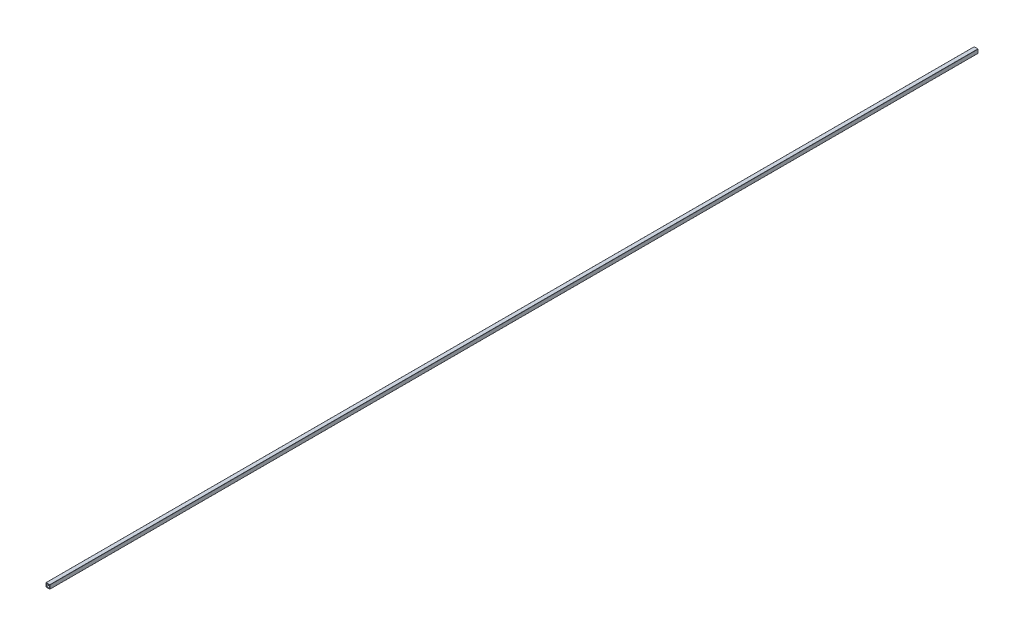
ISO-10303-21;
HEADER;
FILE_DESCRIPTION(('STEP AP214'),'2;1');
FILE_NAME('part.step','',(''),(''),'','','');
FILE_SCHEMA(('AUTOMOTIVE_DESIGN { 1 0 10303 214 1 1 1 1 }'));
ENDSEC;
DATA;
#1=APPLICATION_CONTEXT('core data for automotive mechanical design processes');
#2=APPLICATION_PROTOCOL_DEFINITION('international standard','automotive_design',2000,#1);
#3=PRODUCT_CONTEXT('',#1,'mechanical');
#4=PRODUCT('Part','Part','',(#3));
#5=PRODUCT_RELATED_PRODUCT_CATEGORY('part','',(#4));
#6=PRODUCT_DEFINITION_FORMATION('','',#4);
#7=PRODUCT_DEFINITION_CONTEXT('part definition',#1,'design');
#8=PRODUCT_DEFINITION('design','',#6,#7);
#9=PRODUCT_DEFINITION_SHAPE('','',#8);
#10=(LENGTH_UNIT() NAMED_UNIT(*) SI_UNIT(.MILLI.,.METRE.));
#11=(NAMED_UNIT(*) PLANE_ANGLE_UNIT() SI_UNIT($,.RADIAN.));
#12=(NAMED_UNIT(*) SI_UNIT($,.STERADIAN.) SOLID_ANGLE_UNIT());
#13=UNCERTAINTY_MEASURE_WITH_UNIT(LENGTH_MEASURE(1.E-05),#10,'distance_accuracy_value','');
#14=(GEOMETRIC_REPRESENTATION_CONTEXT(3) GLOBAL_UNCERTAINTY_ASSIGNED_CONTEXT((#13)) GLOBAL_UNIT_ASSIGNED_CONTEXT((#10,
#11,#12)) REPRESENTATION_CONTEXT('',''));
#15=CARTESIAN_POINT('',(0.,0.,0.));
#16=DIRECTION('',(0.,0.,1.));
#17=DIRECTION('',(1.,0.,0.));
#18=AXIS2_PLACEMENT_3D('',#15,#16,#17);
#19=CARTESIAN_POINT('',(11.7,-11.7,6000.));
#20=DIRECTION('',(0.,0.,1.));
#21=DIRECTION('',(1.,0.,0.));
#22=AXIS2_PLACEMENT_3D('',#19,#20,#21);
#23=PLANE('',#22);
#24=CARTESIAN_POINT('',(11.7,-11.7,6000.));
#25=DIRECTION('',(0.,0.,1.));
#26=DIRECTION('',(1.,0.,0.));
#27=AXIS2_PLACEMENT_3D('',#24,#25,#26);
#28=CIRCLE('',#27,0.999999999999999);
#29=CARTESIAN_POINT('',(11.7,-12.7,6000.));
#30=VERTEX_POINT('',#29);
#31=CARTESIAN_POINT('',(12.7,-11.7,6000.));
#32=VERTEX_POINT('',#31);
#33=EDGE_CURVE('E158',#30,#32,#28,.T.);
#34=ORIENTED_EDGE('',*,*,#33,.T.);
#35=DIRECTION('',(0.,1.,0.));
#36=VECTOR('',#35,1.);
#37=CARTESIAN_POINT('',(12.7,-11.7,6000.));
#38=LINE('',#37,#36);
#39=CARTESIAN_POINT('',(12.7,11.7,6000.));
#40=VERTEX_POINT('',#39);
#41=EDGE_CURVE('E161',#32,#40,#38,.T.);
#42=ORIENTED_EDGE('',*,*,#41,.T.);
#43=CARTESIAN_POINT('',(11.7,11.7,6000.));
#44=DIRECTION('',(0.,0.,1.));
#45=DIRECTION('',(-1.,0.,0.));
#46=AXIS2_PLACEMENT_3D('',#43,#44,#45);
#47=CIRCLE('',#46,0.999999999999999);
#48=CARTESIAN_POINT('',(11.7,12.7,6000.));
#49=VERTEX_POINT('',#48);
#50=EDGE_CURVE('E164',#40,#49,#47,.T.);
#51=ORIENTED_EDGE('',*,*,#50,.T.);
#52=DIRECTION('',(-1.,0.,0.));
#53=VECTOR('',#52,1.);
#54=CARTESIAN_POINT('',(-11.7,12.7,6000.));
#55=LINE('',#54,#53);
#56=CARTESIAN_POINT('',(-11.7,12.7,6000.));
#57=VERTEX_POINT('',#56);
#58=EDGE_CURVE('E166',#49,#57,#55,.T.);
#59=ORIENTED_EDGE('',*,*,#58,.T.);
#60=CARTESIAN_POINT('',(-11.7,11.7,6000.));
#61=DIRECTION('',(0.,0.,1.));
#62=DIRECTION('',(-1.,0.,0.));
#63=AXIS2_PLACEMENT_3D('',#60,#61,#62);
#64=CIRCLE('',#63,0.999999999999999);
#65=CARTESIAN_POINT('',(-12.7,11.7,6000.));
#66=VERTEX_POINT('',#65);
#67=EDGE_CURVE('E168',#57,#66,#64,.T.);
#68=ORIENTED_EDGE('',*,*,#67,.T.);
#69=DIRECTION('',(0.,-1.,0.));
#70=VECTOR('',#69,1.);
#71=CARTESIAN_POINT('',(-12.7,-11.7,6000.));
#72=LINE('',#71,#70);
#73=CARTESIAN_POINT('',(-12.7,-11.7,6000.));
#74=VERTEX_POINT('',#73);
#75=EDGE_CURVE('E170',#66,#74,#72,.T.);
#76=ORIENTED_EDGE('',*,*,#75,.T.);
#77=CARTESIAN_POINT('',(-11.7,-11.7,6000.));
#78=DIRECTION('',(0.,0.,1.));
#79=DIRECTION('',(-1.,0.,0.));
#80=AXIS2_PLACEMENT_3D('',#77,#78,#79);
#81=CIRCLE('',#80,0.999999999999999);
#82=CARTESIAN_POINT('',(-11.7,-12.7,6000.));
#83=VERTEX_POINT('',#82);
#84=EDGE_CURVE('E172',#74,#83,#81,.T.);
#85=ORIENTED_EDGE('',*,*,#84,.T.);
#86=DIRECTION('',(1.,0.,0.));
#87=VECTOR('',#86,1.);
#88=CARTESIAN_POINT('',(-11.7,-12.7,6000.));
#89=LINE('',#88,#87);
#90=EDGE_CURVE('E174',#83,#30,#89,.T.);
#91=ORIENTED_EDGE('',*,*,#90,.T.);
#92=EDGE_LOOP('',(#34,#42,#51,#59,#68,#76,#85,#91));
#93=FACE_BOUND('',#92,.T.);
#94=DIRECTION('',(0.,1.,0.));
#95=VECTOR('',#94,1.);
#96=CARTESIAN_POINT('',(9.28,-9.28,6000.));
#97=LINE('',#96,#95);
#98=CARTESIAN_POINT('',(9.28,-9.28,6000.));
#99=VERTEX_POINT('',#98);
#100=CARTESIAN_POINT('',(9.28,9.28,6000.));
#101=VERTEX_POINT('',#100);
#102=EDGE_CURVE('E130',#99,#101,#97,.T.);
#103=ORIENTED_EDGE('',*,*,#102,.F.);
#104=DIRECTION('',(1.,0.,0.));
#105=VECTOR('',#104,1.);
#106=CARTESIAN_POINT('',(-9.28,-9.28,6000.));
#107=LINE('',#106,#105);
#108=CARTESIAN_POINT('',(-9.28,-9.28,6000.));
#109=VERTEX_POINT('',#108);
#110=EDGE_CURVE('E122',#109,#99,#107,.T.);
#111=ORIENTED_EDGE('',*,*,#110,.F.);
#112=DIRECTION('',(0.,-1.,0.));
#113=VECTOR('',#112,1.);
#114=CARTESIAN_POINT('',(-9.28,-9.28,6000.));
#115=LINE('',#114,#113);
#116=CARTESIAN_POINT('',(-9.28,9.28,6000.));
#117=VERTEX_POINT('',#116);
#118=EDGE_CURVE('E144',#117,#109,#115,.T.);
#119=ORIENTED_EDGE('',*,*,#118,.F.);
#120=DIRECTION('',(-1.,0.,0.));
#121=VECTOR('',#120,1.);
#122=CARTESIAN_POINT('',(-9.28,9.28,6000.));
#123=LINE('',#122,#121);
#124=EDGE_CURVE('E142',#101,#117,#123,.T.);
#125=ORIENTED_EDGE('',*,*,#124,.F.);
#126=EDGE_LOOP('',(#103,#111,#119,#125));
#127=FACE_BOUND('',#126,.T.);
#128=ADVANCED_FACE('F33',(#93,#127),#23,.T.);
#129=CARTESIAN_POINT('',(11.7,-11.7,0.));
#130=DIRECTION('',(0.,0.,1.));
#131=DIRECTION('',(1.,0.,0.));
#132=AXIS2_PLACEMENT_3D('',#129,#130,#131);
#133=PLANE('',#132);
#134=CARTESIAN_POINT('',(11.7,-11.7,0.));
#135=DIRECTION('',(0.,0.,1.));
#136=DIRECTION('',(1.,0.,0.));
#137=AXIS2_PLACEMENT_3D('',#134,#135,#136);
#138=CIRCLE('',#137,0.999999999999999);
#139=CARTESIAN_POINT('',(11.7,-12.7,0.));
#140=VERTEX_POINT('',#139);
#141=CARTESIAN_POINT('',(12.7,-11.7,0.));
#142=VERTEX_POINT('',#141);
#143=EDGE_CURVE('E138',#140,#142,#138,.T.);
#144=ORIENTED_EDGE('',*,*,#143,.F.);
#145=DIRECTION('',(1.,0.,0.));
#146=VECTOR('',#145,1.);
#147=CARTESIAN_POINT('',(-11.7,-12.7,0.));
#148=LINE('',#147,#146);
#149=CARTESIAN_POINT('',(-11.7,-12.7,0.));
#150=VERTEX_POINT('',#149);
#151=EDGE_CURVE('E162',#150,#140,#148,.T.);
#152=ORIENTED_EDGE('',*,*,#151,.F.);
#153=CARTESIAN_POINT('',(-11.7,-11.7,0.));
#154=DIRECTION('',(0.,0.,1.));
#155=DIRECTION('',(-1.,0.,0.));
#156=AXIS2_PLACEMENT_3D('',#153,#154,#155);
#157=CIRCLE('',#156,0.999999999999999);
#158=CARTESIAN_POINT('',(-12.7,-11.7,0.));
#159=VERTEX_POINT('',#158);
#160=EDGE_CURVE('E189',#159,#150,#157,.T.);
#161=ORIENTED_EDGE('',*,*,#160,.F.);
#162=DIRECTION('',(0.,-1.,0.));
#163=VECTOR('',#162,1.);
#164=CARTESIAN_POINT('',(-12.7,-11.7,0.));
#165=LINE('',#164,#163);
#166=CARTESIAN_POINT('',(-12.7,11.7,0.));
#167=VERTEX_POINT('',#166);
#168=EDGE_CURVE('E187',#167,#159,#165,.T.);
#169=ORIENTED_EDGE('',*,*,#168,.F.);
#170=CARTESIAN_POINT('',(-11.7,11.7,0.));
#171=DIRECTION('',(0.,0.,1.));
#172=DIRECTION('',(-1.,0.,0.));
#173=AXIS2_PLACEMENT_3D('',#170,#171,#172);
#174=CIRCLE('',#173,0.999999999999999);
#175=CARTESIAN_POINT('',(-11.7,12.7,0.));
#176=VERTEX_POINT('',#175);
#177=EDGE_CURVE('E185',#176,#167,#174,.T.);
#178=ORIENTED_EDGE('',*,*,#177,.F.);
#179=DIRECTION('',(-1.,0.,0.));
#180=VECTOR('',#179,1.);
#181=CARTESIAN_POINT('',(-11.7,12.7,0.));
#182=LINE('',#181,#180);
#183=CARTESIAN_POINT('',(11.7,12.7,0.));
#184=VERTEX_POINT('',#183);
#185=EDGE_CURVE('E183',#184,#176,#182,.T.);
#186=ORIENTED_EDGE('',*,*,#185,.F.);
#187=CARTESIAN_POINT('',(11.7,11.7,0.));
#188=DIRECTION('',(0.,0.,1.));
#189=DIRECTION('',(-1.,0.,0.));
#190=AXIS2_PLACEMENT_3D('',#187,#188,#189);
#191=CIRCLE('',#190,0.999999999999999);
#192=CARTESIAN_POINT('',(12.7,11.7,0.));
#193=VERTEX_POINT('',#192);
#194=EDGE_CURVE('E181',#193,#184,#191,.T.);
#195=ORIENTED_EDGE('',*,*,#194,.F.);
#196=DIRECTION('',(0.,1.,0.));
#197=VECTOR('',#196,1.);
#198=CARTESIAN_POINT('',(12.7,-11.7,0.));
#199=LINE('',#198,#197);
#200=EDGE_CURVE('E179',#142,#193,#199,.T.);
#201=ORIENTED_EDGE('',*,*,#200,.F.);
#202=EDGE_LOOP('',(#144,#152,#161,#169,#178,#186,#195,#201));
#203=FACE_BOUND('',#202,.T.);
#204=DIRECTION('',(1.,0.,0.));
#205=VECTOR('',#204,1.);
#206=CARTESIAN_POINT('',(-9.28,-9.28,0.));
#207=LINE('',#206,#205);
#208=CARTESIAN_POINT('',(-9.28,-9.28,0.));
#209=VERTEX_POINT('',#208);
#210=CARTESIAN_POINT('',(9.28,-9.28,0.));
#211=VERTEX_POINT('',#210);
#212=EDGE_CURVE('E56',#209,#211,#207,.T.);
#213=ORIENTED_EDGE('',*,*,#212,.T.);
#214=DIRECTION('',(0.,1.,0.));
#215=VECTOR('',#214,1.);
#216=CARTESIAN_POINT('',(9.28,-9.28,0.));
#217=LINE('',#216,#215);
#218=CARTESIAN_POINT('',(9.28,9.28,0.));
#219=VERTEX_POINT('',#218);
#220=EDGE_CURVE('E137',#211,#219,#217,.T.);
#221=ORIENTED_EDGE('',*,*,#220,.T.);
#222=DIRECTION('',(-1.,0.,0.));
#223=VECTOR('',#222,1.);
#224=CARTESIAN_POINT('',(-9.28,9.28,0.));
#225=LINE('',#224,#223);
#226=CARTESIAN_POINT('',(-9.28,9.28,0.));
#227=VERTEX_POINT('',#226);
#228=EDGE_CURVE('E150',#219,#227,#225,.T.);
#229=ORIENTED_EDGE('',*,*,#228,.T.);
#230=DIRECTION('',(0.,-1.,0.));
#231=VECTOR('',#230,1.);
#232=CARTESIAN_POINT('',(-9.28,-9.28,0.));
#233=LINE('',#232,#231);
#234=EDGE_CURVE('E131',#227,#209,#233,.T.);
#235=ORIENTED_EDGE('',*,*,#234,.T.);
#236=EDGE_LOOP('',(#213,#221,#229,#235));
#237=FACE_BOUND('',#236,.T.);
#238=ADVANCED_FACE('F219',(#203,#237),#133,.F.);
#239=CARTESIAN_POINT('',(11.7,-11.7,6000.));
#240=DIRECTION('',(0.,0.,-1.));
#241=DIRECTION('',(-1.,0.,0.));
#242=AXIS2_PLACEMENT_3D('',#239,#240,#241);
#243=CYLINDRICAL_SURFACE('',#242,0.999999999999999);
#244=ORIENTED_EDGE('',*,*,#143,.T.);
#245=DIRECTION('',(0.,0.,-1.));
#246=VECTOR('',#245,1.);
#247=CARTESIAN_POINT('',(12.7,-11.7,6000.));
#248=LINE('',#247,#246);
#249=EDGE_CURVE('E11',#32,#142,#248,.T.);
#250=ORIENTED_EDGE('',*,*,#249,.F.);
#251=ORIENTED_EDGE('',*,*,#33,.F.);
#252=DIRECTION('',(0.,0.,-1.));
#253=VECTOR('',#252,1.);
#254=CARTESIAN_POINT('',(11.7,-12.7,6000.));
#255=LINE('',#254,#253);
#256=EDGE_CURVE('E176',#30,#140,#255,.T.);
#257=ORIENTED_EDGE('',*,*,#256,.T.);
#258=EDGE_LOOP('',(#244,#250,#251,#257));
#259=FACE_BOUND('',#258,.T.);
#260=ADVANCED_FACE('F35',(#259),#243,.T.);
#261=CARTESIAN_POINT('',(12.7,-11.7,6000.));
#262=DIRECTION('',(-1.,0.,0.));
#263=DIRECTION('',(0.,0.,1.));
#264=AXIS2_PLACEMENT_3D('',#261,#262,#263);
#265=PLANE('',#264);
#266=ORIENTED_EDGE('',*,*,#200,.T.);
#267=DIRECTION('',(0.,0.,-1.));
#268=VECTOR('',#267,1.);
#269=CARTESIAN_POINT('',(12.7,11.7,6000.));
#270=LINE('',#269,#268);
#271=EDGE_CURVE('E41',#40,#193,#270,.T.);
#272=ORIENTED_EDGE('',*,*,#271,.F.);
#273=ORIENTED_EDGE('',*,*,#41,.F.);
#274=ORIENTED_EDGE('',*,*,#249,.T.);
#275=EDGE_LOOP('',(#266,#272,#273,#274));
#276=FACE_BOUND('',#275,.T.);
#277=ADVANCED_FACE('F236',(#276),#265,.F.);
#278=CARTESIAN_POINT('',(11.7,11.7,6000.));
#279=DIRECTION('',(0.,0.,-1.));
#280=DIRECTION('',(-1.,0.,0.));
#281=AXIS2_PLACEMENT_3D('',#278,#279,#280);
#282=CYLINDRICAL_SURFACE('',#281,0.999999999999999);
#283=ORIENTED_EDGE('',*,*,#194,.T.);
#284=DIRECTION('',(0.,0.,-1.));
#285=VECTOR('',#284,1.);
#286=CARTESIAN_POINT('',(11.7,12.7,6000.));
#287=LINE('',#286,#285);
#288=EDGE_CURVE('E206',#49,#184,#287,.T.);
#289=ORIENTED_EDGE('',*,*,#288,.F.);
#290=ORIENTED_EDGE('',*,*,#50,.F.);
#291=ORIENTED_EDGE('',*,*,#271,.T.);
#292=EDGE_LOOP('',(#283,#289,#290,#291));
#293=FACE_BOUND('',#292,.T.);
#294=ADVANCED_FACE('F213',(#293),#282,.T.);
#295=CARTESIAN_POINT('',(-11.7,12.7,6000.));
#296=DIRECTION('',(0.,-1.,0.));
#297=DIRECTION('',(0.,0.,-1.));
#298=AXIS2_PLACEMENT_3D('',#295,#296,#297);
#299=PLANE('',#298);
#300=ORIENTED_EDGE('',*,*,#185,.T.);
#301=DIRECTION('',(0.,0.,-1.));
#302=VECTOR('',#301,1.);
#303=CARTESIAN_POINT('',(-11.7,12.7,6000.));
#304=LINE('',#303,#302);
#305=EDGE_CURVE('E203',#57,#176,#304,.T.);
#306=ORIENTED_EDGE('',*,*,#305,.F.);
#307=ORIENTED_EDGE('',*,*,#58,.F.);
#308=ORIENTED_EDGE('',*,*,#288,.T.);
#309=EDGE_LOOP('',(#300,#306,#307,#308));
#310=FACE_BOUND('',#309,.T.);
#311=ADVANCED_FACE('F225',(#310),#299,.F.);
#312=CARTESIAN_POINT('',(-11.7,11.7,6000.));
#313=DIRECTION('',(0.,0.,-1.));
#314=DIRECTION('',(-1.,0.,0.));
#315=AXIS2_PLACEMENT_3D('',#312,#313,#314);
#316=CYLINDRICAL_SURFACE('',#315,0.999999999999999);
#317=ORIENTED_EDGE('',*,*,#177,.T.);
#318=DIRECTION('',(0.,0.,-1.));
#319=VECTOR('',#318,1.);
#320=CARTESIAN_POINT('',(-12.7,11.7,6000.));
#321=LINE('',#320,#319);
#322=EDGE_CURVE('E200',#66,#167,#321,.T.);
#323=ORIENTED_EDGE('',*,*,#322,.F.);
#324=ORIENTED_EDGE('',*,*,#67,.F.);
#325=ORIENTED_EDGE('',*,*,#305,.T.);
#326=EDGE_LOOP('',(#317,#323,#324,#325));
#327=FACE_BOUND('',#326,.T.);
#328=ADVANCED_FACE('F229',(#327),#316,.T.);
#329=CARTESIAN_POINT('',(-12.7,-11.7,6000.));
#330=DIRECTION('',(1.,0.,0.));
#331=DIRECTION('',(0.,0.,-1.));
#332=AXIS2_PLACEMENT_3D('',#329,#330,#331);
#333=PLANE('',#332);
#334=ORIENTED_EDGE('',*,*,#168,.T.);
#335=DIRECTION('',(0.,0.,-1.));
#336=VECTOR('',#335,1.);
#337=CARTESIAN_POINT('',(-12.7,-11.7,6000.));
#338=LINE('',#337,#336);
#339=EDGE_CURVE('E197',#74,#159,#338,.T.);
#340=ORIENTED_EDGE('',*,*,#339,.F.);
#341=ORIENTED_EDGE('',*,*,#75,.F.);
#342=ORIENTED_EDGE('',*,*,#322,.T.);
#343=EDGE_LOOP('',(#334,#340,#341,#342));
#344=FACE_BOUND('',#343,.T.);
#345=ADVANCED_FACE('F249',(#344),#333,.F.);
#346=CARTESIAN_POINT('',(-11.7,-11.7,6000.));
#347=DIRECTION('',(0.,0.,-1.));
#348=DIRECTION('',(-1.,0.,0.));
#349=AXIS2_PLACEMENT_3D('',#346,#347,#348);
#350=CYLINDRICAL_SURFACE('',#349,0.999999999999999);
#351=ORIENTED_EDGE('',*,*,#160,.T.);
#352=DIRECTION('',(0.,0.,-1.));
#353=VECTOR('',#352,1.);
#354=CARTESIAN_POINT('',(-11.7,-12.7,6000.));
#355=LINE('',#354,#353);
#356=EDGE_CURVE('E194',#83,#150,#355,.T.);
#357=ORIENTED_EDGE('',*,*,#356,.F.);
#358=ORIENTED_EDGE('',*,*,#84,.F.);
#359=ORIENTED_EDGE('',*,*,#339,.T.);
#360=EDGE_LOOP('',(#351,#357,#358,#359));
#361=FACE_BOUND('',#360,.T.);
#362=ADVANCED_FACE('F247',(#361),#350,.T.);
#363=CARTESIAN_POINT('',(-11.7,-12.7,6000.));
#364=DIRECTION('',(0.,1.,0.));
#365=DIRECTION('',(0.,0.,1.));
#366=AXIS2_PLACEMENT_3D('',#363,#364,#365);
#367=PLANE('',#366);
#368=ORIENTED_EDGE('',*,*,#151,.T.);
#369=ORIENTED_EDGE('',*,*,#256,.F.);
#370=ORIENTED_EDGE('',*,*,#90,.F.);
#371=ORIENTED_EDGE('',*,*,#356,.T.);
#372=EDGE_LOOP('',(#368,#369,#370,#371));
#373=FACE_BOUND('',#372,.T.);
#374=ADVANCED_FACE('F242',(#373),#367,.F.);
#375=CARTESIAN_POINT('',(-9.28,-9.28,6000.));
#376=DIRECTION('',(0.,1.,0.));
#377=DIRECTION('',(0.,0.,1.));
#378=AXIS2_PLACEMENT_3D('',#375,#376,#377);
#379=PLANE('',#378);
#380=ORIENTED_EDGE('',*,*,#212,.F.);
#381=DIRECTION('',(0.,0.,-1.));
#382=VECTOR('',#381,1.);
#383=CARTESIAN_POINT('',(-9.28,-9.28,6000.));
#384=LINE('',#383,#382);
#385=EDGE_CURVE('E126',#109,#209,#384,.T.);
#386=ORIENTED_EDGE('',*,*,#385,.F.);
#387=ORIENTED_EDGE('',*,*,#110,.T.);
#388=DIRECTION('',(0.,0.,-1.));
#389=VECTOR('',#388,1.);
#390=CARTESIAN_POINT('',(9.28,-9.28,6000.));
#391=LINE('',#390,#389);
#392=EDGE_CURVE('E125',#99,#211,#391,.T.);
#393=ORIENTED_EDGE('',*,*,#392,.T.);
#394=EDGE_LOOP('',(#380,#386,#387,#393));
#395=FACE_BOUND('',#394,.T.);
#396=ADVANCED_FACE('F124',(#395),#379,.T.);
#397=CARTESIAN_POINT('',(9.28,-9.28,6000.));
#398=DIRECTION('',(-1.,0.,0.));
#399=DIRECTION('',(0.,-1.,0.));
#400=AXIS2_PLACEMENT_3D('',#397,#398,#399);
#401=PLANE('',#400);
#402=ORIENTED_EDGE('',*,*,#220,.F.);
#403=ORIENTED_EDGE('',*,*,#392,.F.);
#404=ORIENTED_EDGE('',*,*,#102,.T.);
#405=DIRECTION('',(0.,0.,-1.));
#406=VECTOR('',#405,1.);
#407=CARTESIAN_POINT('',(9.28,9.28,6000.));
#408=LINE('',#407,#406);
#409=EDGE_CURVE('E139',#101,#219,#408,.T.);
#410=ORIENTED_EDGE('',*,*,#409,.T.);
#411=EDGE_LOOP('',(#402,#403,#404,#410));
#412=FACE_BOUND('',#411,.T.);
#413=ADVANCED_FACE('F134',(#412),#401,.T.);
#414=CARTESIAN_POINT('',(-9.28,9.28,6000.));
#415=DIRECTION('',(0.,-1.,0.));
#416=DIRECTION('',(0.,0.,-1.));
#417=AXIS2_PLACEMENT_3D('',#414,#415,#416);
#418=PLANE('',#417);
#419=ORIENTED_EDGE('',*,*,#228,.F.);
#420=ORIENTED_EDGE('',*,*,#409,.F.);
#421=ORIENTED_EDGE('',*,*,#124,.T.);
#422=DIRECTION('',(0.,0.,-1.));
#423=VECTOR('',#422,1.);
#424=CARTESIAN_POINT('',(-9.28,9.28,6000.));
#425=LINE('',#424,#423);
#426=EDGE_CURVE('E48',#117,#227,#425,.T.);
#427=ORIENTED_EDGE('',*,*,#426,.T.);
#428=EDGE_LOOP('',(#419,#420,#421,#427));
#429=FACE_BOUND('',#428,.T.);
#430=ADVANCED_FACE('F274',(#429),#418,.T.);
#431=CARTESIAN_POINT('',(-9.28,-9.28,6000.));
#432=DIRECTION('',(1.,0.,0.));
#433=DIRECTION('',(0.,0.,-1.));
#434=AXIS2_PLACEMENT_3D('',#431,#432,#433);
#435=PLANE('',#434);
#436=ORIENTED_EDGE('',*,*,#234,.F.);
#437=ORIENTED_EDGE('',*,*,#426,.F.);
#438=ORIENTED_EDGE('',*,*,#118,.T.);
#439=ORIENTED_EDGE('',*,*,#385,.T.);
#440=EDGE_LOOP('',(#436,#437,#438,#439));
#441=FACE_BOUND('',#440,.T.);
#442=ADVANCED_FACE('F278',(#441),#435,.T.);
#443=CLOSED_SHELL('',(#128,#238,#260,#277,#294,#311,#328,#345,#362,#374,#396,#413,#430,#442));
#444=MANIFOLD_SOLID_BREP('B2',#443);
#445=ADVANCED_BREP_SHAPE_REPRESENTATION('',(#18,#444),#14);
#446=SHAPE_DEFINITION_REPRESENTATION(#9,#445);
ENDSEC;
END-ISO-10303-21;
